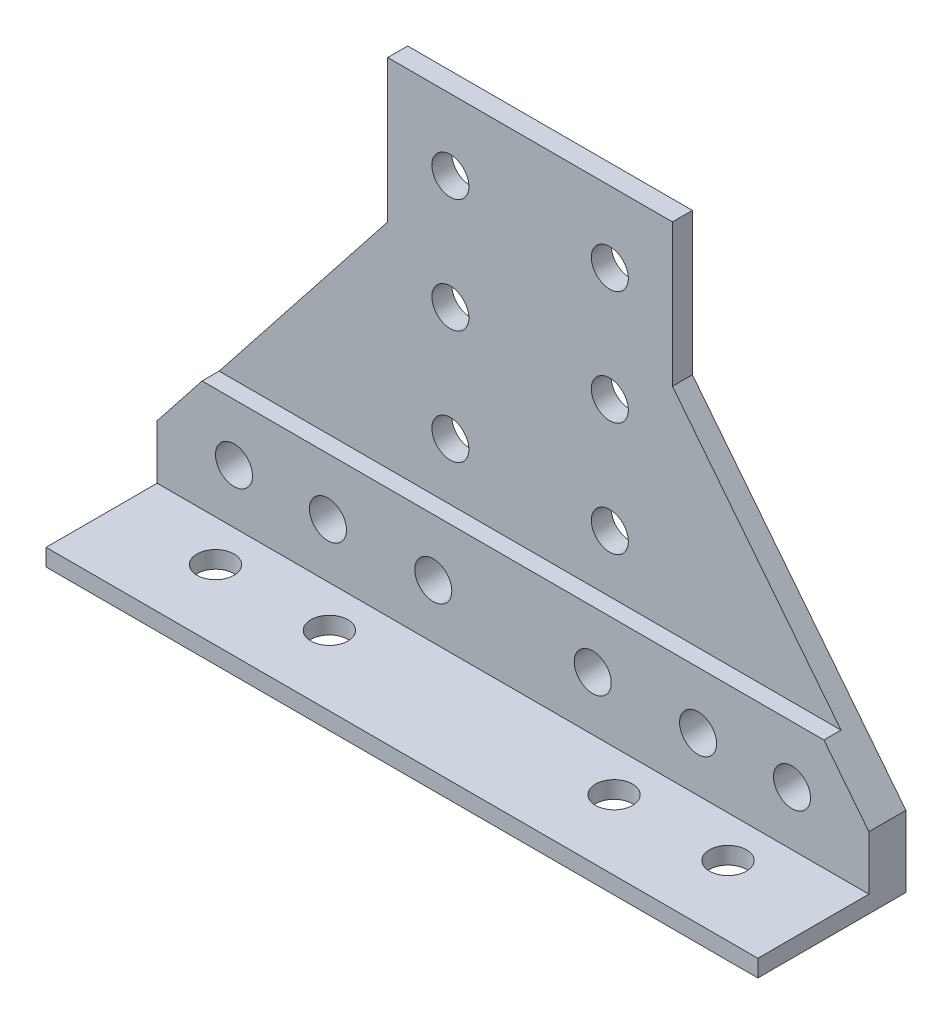
ISO-10303-21;
HEADER;
FILE_DESCRIPTION(('STEP AP214'),'2;1');
FILE_NAME('part.step','',(''),(''),'','','');
FILE_SCHEMA(('AUTOMOTIVE_DESIGN { 1 0 10303 214 1 1 1 1 }'));
ENDSEC;
DATA;
#1=APPLICATION_CONTEXT('core data for automotive mechanical design processes');
#2=APPLICATION_PROTOCOL_DEFINITION('international standard','automotive_design',2000,#1);
#3=PRODUCT_CONTEXT('',#1,'mechanical');
#4=PRODUCT('Part','Part','',(#3));
#5=PRODUCT_RELATED_PRODUCT_CATEGORY('part','',(#4));
#6=PRODUCT_DEFINITION_FORMATION('','',#4);
#7=PRODUCT_DEFINITION_CONTEXT('part definition',#1,'design');
#8=PRODUCT_DEFINITION('design','',#6,#7);
#9=PRODUCT_DEFINITION_SHAPE('','',#8);
#10=(LENGTH_UNIT() NAMED_UNIT(*) SI_UNIT(.MILLI.,.METRE.));
#11=(NAMED_UNIT(*) PLANE_ANGLE_UNIT() SI_UNIT($,.RADIAN.));
#12=(NAMED_UNIT(*) SI_UNIT($,.STERADIAN.) SOLID_ANGLE_UNIT());
#13=UNCERTAINTY_MEASURE_WITH_UNIT(LENGTH_MEASURE(1.E-05),#10,'distance_accuracy_value','');
#14=(GEOMETRIC_REPRESENTATION_CONTEXT(3) GLOBAL_UNCERTAINTY_ASSIGNED_CONTEXT((#13)) GLOBAL_UNIT_ASSIGNED_CONTEXT((#10,
#11,#12)) REPRESENTATION_CONTEXT('',''));
#15=CARTESIAN_POINT('',(0.,0.,0.));
#16=DIRECTION('',(0.,0.,1.));
#17=DIRECTION('',(1.,0.,0.));
#18=AXIS2_PLACEMENT_3D('',#15,#16,#17);
#19=CARTESIAN_POINT('',(0.,0.,14.));
#20=DIRECTION('',(0.,1.,0.));
#21=DIRECTION('',(0.,0.,1.));
#22=AXIS2_PLACEMENT_3D('',#19,#20,#21);
#23=PLANE('',#22);
#24=CARTESIAN_POINT('',(180.,0.,55.));
#25=DIRECTION('',(0.,1.,0.));
#26=DIRECTION('',(0.,0.,-1.));
#27=AXIS2_PLACEMENT_3D('',#24,#25,#26);
#28=CIRCLE('',#27,13.);
#29=CARTESIAN_POINT('',(180.,0.,42.));
#30=VERTEX_POINT('',#29);
#31=EDGE_CURVE('E190',#30,#30,#28,.T.);
#32=ORIENTED_EDGE('',*,*,#31,.T.);
#33=EDGE_LOOP('',(#32));
#34=FACE_BOUND('',#33,.T.);
#35=CARTESIAN_POINT('',(-99.9999999999999,0.,55.));
#36=DIRECTION('',(0.,-1.,0.));
#37=DIRECTION('',(0.,0.,-1.));
#38=AXIS2_PLACEMENT_3D('',#35,#36,#37);
#39=CIRCLE('',#38,13.);
#40=CARTESIAN_POINT('',(-99.9999999999999,0.,42.));
#41=VERTEX_POINT('',#40);
#42=EDGE_CURVE('E187',#41,#41,#39,.T.);
#43=ORIENTED_EDGE('',*,*,#42,.F.);
#44=EDGE_LOOP('',(#43));
#45=FACE_BOUND('',#44,.T.);
#46=CARTESIAN_POINT('',(-180.,0.,55.));
#47=DIRECTION('',(0.,-1.,0.));
#48=DIRECTION('',(0.,0.,-1.));
#49=AXIS2_PLACEMENT_3D('',#46,#47,#48);
#50=CIRCLE('',#49,13.);
#51=CARTESIAN_POINT('',(-180.,0.,42.));
#52=VERTEX_POINT('',#51);
#53=EDGE_CURVE('E159',#52,#52,#50,.T.);
#54=ORIENTED_EDGE('',*,*,#53,.F.);
#55=EDGE_LOOP('',(#54));
#56=FACE_BOUND('',#55,.T.);
#57=DIRECTION('',(1.,0.,0.));
#58=VECTOR('',#57,1.);
#59=CARTESIAN_POINT('',(0.,0.,0.));
#60=LINE('',#59,#58);
#61=CARTESIAN_POINT('',(-250.,0.,0.));
#62=VERTEX_POINT('',#61);
#63=CARTESIAN_POINT('',(250.,0.,0.));
#64=VERTEX_POINT('',#63);
#65=EDGE_CURVE('E327',#62,#64,#60,.T.);
#66=ORIENTED_EDGE('',*,*,#65,.T.);
#67=DIRECTION('',(0.,0.,-1.));
#68=VECTOR('',#67,1.);
#69=CARTESIAN_POINT('',(250.,0.,14.));
#70=LINE('',#69,#68);
#71=CARTESIAN_POINT('',(250.,0.,104.));
#72=VERTEX_POINT('',#71);
#73=EDGE_CURVE('E141',#72,#64,#70,.T.);
#74=ORIENTED_EDGE('',*,*,#73,.F.);
#75=DIRECTION('',(1.,0.,0.));
#76=VECTOR('',#75,1.);
#77=CARTESIAN_POINT('',(-250.,0.,104.));
#78=LINE('',#77,#76);
#79=CARTESIAN_POINT('',(-250.,0.,104.));
#80=VERTEX_POINT('',#79);
#81=EDGE_CURVE('E144',#80,#72,#78,.T.);
#82=ORIENTED_EDGE('',*,*,#81,.F.);
#83=DIRECTION('',(0.,0.,-1.));
#84=VECTOR('',#83,1.);
#85=CARTESIAN_POINT('',(-250.,0.,14.));
#86=LINE('',#85,#84);
#87=EDGE_CURVE('E130',#80,#62,#86,.T.);
#88=ORIENTED_EDGE('',*,*,#87,.T.);
#89=EDGE_LOOP('',(#66,#74,#82,#88));
#90=FACE_BOUND('',#89,.T.);
#91=CARTESIAN_POINT('',(99.9999999999999,0.,55.));
#92=DIRECTION('',(0.,1.,0.));
#93=DIRECTION('',(0.,0.,-1.));
#94=AXIS2_PLACEMENT_3D('',#91,#92,#93);
#95=CIRCLE('',#94,13.);
#96=CARTESIAN_POINT('',(99.9999999999999,0.,42.));
#97=VERTEX_POINT('',#96);
#98=EDGE_CURVE('E199',#97,#97,#95,.T.);
#99=ORIENTED_EDGE('',*,*,#98,.T.);
#100=EDGE_LOOP('',(#99));
#101=FACE_BOUND('',#100,.T.);
#102=ADVANCED_FACE('F36',(#34,#45,#56,#90,#101),#23,.F.);
#103=CARTESIAN_POINT('',(-250.,12.,104.));
#104=DIRECTION('',(0.,-1.,0.));
#105=DIRECTION('',(0.,0.,-1.));
#106=AXIS2_PLACEMENT_3D('',#103,#104,#105);
#107=PLANE('',#106);
#108=CARTESIAN_POINT('',(180.,12.,55.));
#109=DIRECTION('',(0.,-1.,0.));
#110=DIRECTION('',(0.,0.,-1.));
#111=AXIS2_PLACEMENT_3D('',#108,#109,#110);
#112=CIRCLE('',#111,13.);
#113=CARTESIAN_POINT('',(180.,12.,42.));
#114=VERTEX_POINT('',#113);
#115=EDGE_CURVE('E188',#114,#114,#112,.F.);
#116=ORIENTED_EDGE('',*,*,#115,.F.);
#117=EDGE_LOOP('',(#116));
#118=FACE_BOUND('',#117,.T.);
#119=CARTESIAN_POINT('',(-99.9999999999999,12.,55.));
#120=DIRECTION('',(0.,-1.,0.));
#121=DIRECTION('',(0.,0.,-1.));
#122=AXIS2_PLACEMENT_3D('',#119,#120,#121);
#123=CIRCLE('',#122,13.);
#124=CARTESIAN_POINT('',(-99.9999999999999,12.,42.));
#125=VERTEX_POINT('',#124);
#126=EDGE_CURVE('E185',#125,#125,#123,.T.);
#127=ORIENTED_EDGE('',*,*,#126,.T.);
#128=EDGE_LOOP('',(#127));
#129=FACE_BOUND('',#128,.T.);
#130=CARTESIAN_POINT('',(-180.,12.,55.));
#131=DIRECTION('',(0.,-1.,0.));
#132=DIRECTION('',(0.,0.,-1.));
#133=AXIS2_PLACEMENT_3D('',#130,#131,#132);
#134=CIRCLE('',#133,13.);
#135=CARTESIAN_POINT('',(-180.,12.,42.));
#136=VERTEX_POINT('',#135);
#137=EDGE_CURVE('E156',#136,#136,#134,.T.);
#138=ORIENTED_EDGE('',*,*,#137,.T.);
#139=EDGE_LOOP('',(#138));
#140=FACE_BOUND('',#139,.T.);
#141=DIRECTION('',(-1.,0.,0.));
#142=VECTOR('',#141,1.);
#143=CARTESIAN_POINT('',(-250.,12.,26.));
#144=LINE('',#143,#142);
#145=CARTESIAN_POINT('',(250.,12.,26.));
#146=VERTEX_POINT('',#145);
#147=CARTESIAN_POINT('',(-250.,12.,26.));
#148=VERTEX_POINT('',#147);
#149=EDGE_CURVE('E53',#146,#148,#144,.T.);
#150=ORIENTED_EDGE('',*,*,#149,.T.);
#151=DIRECTION('',(0.,0.,-1.));
#152=VECTOR('',#151,1.);
#153=CARTESIAN_POINT('',(-250.,12.,104.));
#154=LINE('',#153,#152);
#155=CARTESIAN_POINT('',(-250.,12.,104.));
#156=VERTEX_POINT('',#155);
#157=EDGE_CURVE('E164',#156,#148,#154,.T.);
#158=ORIENTED_EDGE('',*,*,#157,.F.);
#159=DIRECTION('',(-1.,0.,0.));
#160=VECTOR('',#159,1.);
#161=CARTESIAN_POINT('',(-250.,12.,104.));
#162=LINE('',#161,#160);
#163=CARTESIAN_POINT('',(250.,12.,104.));
#164=VERTEX_POINT('',#163);
#165=EDGE_CURVE('E153',#164,#156,#162,.T.);
#166=ORIENTED_EDGE('',*,*,#165,.F.);
#167=DIRECTION('',(0.,0.,-1.));
#168=VECTOR('',#167,1.);
#169=CARTESIAN_POINT('',(250.,12.,104.));
#170=LINE('',#169,#168);
#171=EDGE_CURVE('E175',#164,#146,#170,.T.);
#172=ORIENTED_EDGE('',*,*,#171,.T.);
#173=EDGE_LOOP('',(#150,#158,#166,#172));
#174=FACE_BOUND('',#173,.T.);
#175=CARTESIAN_POINT('',(99.9999999999999,12.,55.));
#176=DIRECTION('',(0.,-1.,0.));
#177=DIRECTION('',(0.,0.,-1.));
#178=AXIS2_PLACEMENT_3D('',#175,#176,#177);
#179=CIRCLE('',#178,13.);
#180=CARTESIAN_POINT('',(99.9999999999999,12.,42.));
#181=VERTEX_POINT('',#180);
#182=EDGE_CURVE('E40',#181,#181,#179,.F.);
#183=ORIENTED_EDGE('',*,*,#182,.F.);
#184=EDGE_LOOP('',(#183));
#185=FACE_BOUND('',#184,.T.);
#186=ADVANCED_FACE('F211',(#118,#129,#140,#174,#185),#107,.F.);
#187=CARTESIAN_POINT('',(-100.,340.,0.));
#188=DIRECTION('',(0.,0.,1.));
#189=DIRECTION('',(1.,0.,0.));
#190=AXIS2_PLACEMENT_3D('',#187,#188,#189);
#191=PLANE('',#190);
#192=CARTESIAN_POINT('',(130.,50.,0.));
#193=DIRECTION('',(0.,0.,-1.));
#194=DIRECTION('',(-1.,0.,0.));
#195=AXIS2_PLACEMENT_3D('',#192,#193,#194);
#196=CIRCLE('',#195,13.);
#197=CARTESIAN_POINT('',(117.,50.,0.));
#198=VERTEX_POINT('',#197);
#199=EDGE_CURVE('E427',#198,#198,#196,.T.);
#200=ORIENTED_EDGE('',*,*,#199,.F.);
#201=EDGE_LOOP('',(#200));
#202=FACE_BOUND('',#201,.T.);
#203=CARTESIAN_POINT('',(56.,130.,0.));
#204=DIRECTION('',(0.,0.,-1.));
#205=DIRECTION('',(-1.,0.,0.));
#206=AXIS2_PLACEMENT_3D('',#203,#204,#205);
#207=CIRCLE('',#206,13.);
#208=CARTESIAN_POINT('',(43.,130.,0.));
#209=VERTEX_POINT('',#208);
#210=EDGE_CURVE('E390',#209,#209,#207,.T.);
#211=ORIENTED_EDGE('',*,*,#210,.F.);
#212=EDGE_LOOP('',(#211));
#213=FACE_BOUND('',#212,.T.);
#214=CARTESIAN_POINT('',(56.,290.,0.));
#215=DIRECTION('',(0.,0.,-1.));
#216=DIRECTION('',(-1.,0.,0.));
#217=AXIS2_PLACEMENT_3D('',#214,#215,#216);
#218=CIRCLE('',#217,13.);
#219=CARTESIAN_POINT('',(43.,290.,0.));
#220=VERTEX_POINT('',#219);
#221=EDGE_CURVE('E450',#220,#220,#218,.T.);
#222=ORIENTED_EDGE('',*,*,#221,.F.);
#223=EDGE_LOOP('',(#222));
#224=FACE_BOUND('',#223,.T.);
#225=CARTESIAN_POINT('',(-56.,210.,0.));
#226=DIRECTION('',(0.,0.,1.));
#227=DIRECTION('',(1.,0.,0.));
#228=AXIS2_PLACEMENT_3D('',#225,#226,#227);
#229=CIRCLE('',#228,13.);
#230=CARTESIAN_POINT('',(-43.,210.,0.));
#231=VERTEX_POINT('',#230);
#232=EDGE_CURVE('E454',#231,#231,#229,.T.);
#233=ORIENTED_EDGE('',*,*,#232,.T.);
#234=EDGE_LOOP('',(#233));
#235=FACE_BOUND('',#234,.T.);
#236=CARTESIAN_POINT('',(-56.,290.,0.));
#237=DIRECTION('',(0.,0.,1.));
#238=DIRECTION('',(1.,0.,0.));
#239=AXIS2_PLACEMENT_3D('',#236,#237,#238);
#240=CIRCLE('',#239,13.);
#241=CARTESIAN_POINT('',(-43.,290.,0.));
#242=VERTEX_POINT('',#241);
#243=EDGE_CURVE('E320',#242,#242,#240,.T.);
#244=ORIENTED_EDGE('',*,*,#243,.T.);
#245=EDGE_LOOP('',(#244));
#246=FACE_BOUND('',#245,.T.);
#247=DIRECTION('',(0.,-1.,0.));
#248=VECTOR('',#247,1.);
#249=CARTESIAN_POINT('',(-100.,340.,0.));
#250=LINE('',#249,#248);
#251=CARTESIAN_POINT('',(-100.,340.,0.));
#252=VERTEX_POINT('',#251);
#253=CARTESIAN_POINT('',(-100.,240.,0.));
#254=VERTEX_POINT('',#253);
#255=EDGE_CURVE('E310',#252,#254,#250,.T.);
#256=ORIENTED_EDGE('',*,*,#255,.F.);
#257=DIRECTION('',(-1.,0.,0.));
#258=VECTOR('',#257,1.);
#259=CARTESIAN_POINT('',(0.,340.,0.));
#260=LINE('',#259,#258);
#261=CARTESIAN_POINT('',(100.,340.,0.));
#262=VERTEX_POINT('',#261);
#263=EDGE_CURVE('E338',#262,#252,#260,.T.);
#264=ORIENTED_EDGE('',*,*,#263,.F.);
#265=DIRECTION('',(0.,1.,0.));
#266=VECTOR('',#265,1.);
#267=CARTESIAN_POINT('',(100.,340.,0.));
#268=LINE('',#267,#266);
#269=CARTESIAN_POINT('',(100.,240.,0.));
#270=VERTEX_POINT('',#269);
#271=EDGE_CURVE('E336',#270,#262,#268,.T.);
#272=ORIENTED_EDGE('',*,*,#271,.F.);
#273=DIRECTION('',(-0.619644288579021,0.784882765533426,0.));
#274=VECTOR('',#273,1.);
#275=CARTESIAN_POINT('',(100.,240.,0.));
#276=LINE('',#275,#274);
#277=CARTESIAN_POINT('',(250.,50.,0.));
#278=VERTEX_POINT('',#277);
#279=EDGE_CURVE('E334',#278,#270,#276,.T.);
#280=ORIENTED_EDGE('',*,*,#279,.F.);
#281=DIRECTION('',(0.,1.,0.));
#282=VECTOR('',#281,1.);
#283=CARTESIAN_POINT('',(250.,0.,0.));
#284=LINE('',#283,#282);
#285=EDGE_CURVE('E332',#64,#278,#284,.T.);
#286=ORIENTED_EDGE('',*,*,#285,.F.);
#287=ORIENTED_EDGE('',*,*,#65,.F.);
#288=DIRECTION('',(0.,-1.,0.));
#289=VECTOR('',#288,1.);
#290=CARTESIAN_POINT('',(-250.,0.,0.));
#291=LINE('',#290,#289);
#292=CARTESIAN_POINT('',(-250.,50.,0.));
#293=VERTEX_POINT('',#292);
#294=EDGE_CURVE('E138',#293,#62,#291,.T.);
#295=ORIENTED_EDGE('',*,*,#294,.F.);
#296=DIRECTION('',(-0.619644288579021,-0.784882765533426,0.));
#297=VECTOR('',#296,1.);
#298=CARTESIAN_POINT('',(-100.,240.,0.));
#299=LINE('',#298,#297);
#300=EDGE_CURVE('E319',#254,#293,#299,.T.);
#301=ORIENTED_EDGE('',*,*,#300,.F.);
#302=EDGE_LOOP('',(#256,#264,#272,#280,#286,#287,#295,#301));
#303=FACE_BOUND('',#302,.T.);
#304=CARTESIAN_POINT('',(-56.,130.,0.));
#305=DIRECTION('',(0.,0.,1.));
#306=DIRECTION('',(1.,0.,0.));
#307=AXIS2_PLACEMENT_3D('',#304,#305,#306);
#308=CIRCLE('',#307,13.);
#309=CARTESIAN_POINT('',(-43.,130.,0.));
#310=VERTEX_POINT('',#309);
#311=EDGE_CURVE('E45',#310,#310,#308,.T.);
#312=ORIENTED_EDGE('',*,*,#311,.T.);
#313=EDGE_LOOP('',(#312));
#314=FACE_BOUND('',#313,.T.);
#315=CARTESIAN_POINT('',(56.,210.,0.));
#316=DIRECTION('',(0.,0.,-1.));
#317=DIRECTION('',(-1.,0.,0.));
#318=AXIS2_PLACEMENT_3D('',#315,#316,#317);
#319=CIRCLE('',#318,13.);
#320=CARTESIAN_POINT('',(43.,210.,0.));
#321=VERTEX_POINT('',#320);
#322=EDGE_CURVE('E469',#321,#321,#319,.T.);
#323=ORIENTED_EDGE('',*,*,#322,.F.);
#324=EDGE_LOOP('',(#323));
#325=FACE_BOUND('',#324,.T.);
#326=CARTESIAN_POINT('',(-56.,50.,0.));
#327=DIRECTION('',(0.,0.,1.));
#328=DIRECTION('',(1.,0.,0.));
#329=AXIS2_PLACEMENT_3D('',#326,#327,#328);
#330=CIRCLE('',#329,13.);
#331=CARTESIAN_POINT('',(-43.,50.,0.));
#332=VERTEX_POINT('',#331);
#333=EDGE_CURVE('E393',#332,#332,#330,.T.);
#334=ORIENTED_EDGE('',*,*,#333,.T.);
#335=EDGE_LOOP('',(#334));
#336=FACE_BOUND('',#335,.T.);
#337=CARTESIAN_POINT('',(-130.,50.,0.));
#338=DIRECTION('',(0.,0.,1.));
#339=DIRECTION('',(1.,0.,0.));
#340=AXIS2_PLACEMENT_3D('',#337,#338,#339);
#341=CIRCLE('',#340,13.);
#342=CARTESIAN_POINT('',(-117.,50.,0.));
#343=VERTEX_POINT('',#342);
#344=EDGE_CURVE('E409',#343,#343,#341,.T.);
#345=ORIENTED_EDGE('',*,*,#344,.T.);
#346=EDGE_LOOP('',(#345));
#347=FACE_BOUND('',#346,.T.);
#348=CARTESIAN_POINT('',(-196.,50.,0.));
#349=DIRECTION('',(0.,0.,1.));
#350=DIRECTION('',(1.,0.,0.));
#351=AXIS2_PLACEMENT_3D('',#348,#349,#350);
#352=CIRCLE('',#351,13.);
#353=CARTESIAN_POINT('',(-183.,50.,0.));
#354=VERTEX_POINT('',#353);
#355=EDGE_CURVE('E415',#354,#354,#352,.T.);
#356=ORIENTED_EDGE('',*,*,#355,.T.);
#357=EDGE_LOOP('',(#356));
#358=FACE_BOUND('',#357,.T.);
#359=CARTESIAN_POINT('',(56.,50.,0.));
#360=DIRECTION('',(0.,0.,-1.));
#361=DIRECTION('',(-1.,0.,0.));
#362=AXIS2_PLACEMENT_3D('',#359,#360,#361);
#363=CIRCLE('',#362,13.);
#364=CARTESIAN_POINT('',(43.,50.,0.));
#365=VERTEX_POINT('',#364);
#366=EDGE_CURVE('E421',#365,#365,#363,.T.);
#367=ORIENTED_EDGE('',*,*,#366,.F.);
#368=EDGE_LOOP('',(#367));
#369=FACE_BOUND('',#368,.T.);
#370=CARTESIAN_POINT('',(196.,50.,0.));
#371=DIRECTION('',(0.,0.,-1.));
#372=DIRECTION('',(-1.,0.,0.));
#373=AXIS2_PLACEMENT_3D('',#370,#371,#372);
#374=CIRCLE('',#373,13.);
#375=CARTESIAN_POINT('',(183.,50.,0.));
#376=VERTEX_POINT('',#375);
#377=EDGE_CURVE('E167',#376,#376,#374,.T.);
#378=ORIENTED_EDGE('',*,*,#377,.F.);
#379=EDGE_LOOP('',(#378));
#380=FACE_BOUND('',#379,.T.);
#381=ADVANCED_FACE('F213',(#202,#213,#224,#235,#246,#303,#314,#325,#336,#347,#358,#369,#380),
#191,.F.);
#382=CARTESIAN_POINT('',(0.,0.,26.));
#383=DIRECTION('',(0.,0.,1.));
#384=DIRECTION('',(1.,0.,0.));
#385=AXIS2_PLACEMENT_3D('',#382,#383,#384);
#386=PLANE('',#385);
#387=ORIENTED_EDGE('',*,*,#149,.F.);
#388=DIRECTION('',(0.,1.,0.));
#389=VECTOR('',#388,1.);
#390=CARTESIAN_POINT('',(250.,0.,26.));
#391=LINE('',#390,#389);
#392=CARTESIAN_POINT('',(250.,49.9999999999999,26.));
#393=VERTEX_POINT('',#392);
#394=EDGE_CURVE('E171',#146,#393,#391,.T.);
#395=ORIENTED_EDGE('',*,*,#394,.T.);
#396=DIRECTION('',(-0.619644288579021,0.784882765533426,0.));
#397=VECTOR('',#396,1.);
#398=CARTESIAN_POINT('',(178.327645051195,140.784982935154,26.));
#399=LINE('',#398,#397);
#400=CARTESIAN_POINT('',(218.421052631579,90.,26.));
#401=VERTEX_POINT('',#400);
#402=EDGE_CURVE('E379',#393,#401,#399,.T.);
#403=ORIENTED_EDGE('',*,*,#402,.T.);
#404=DIRECTION('',(1.,0.,0.));
#405=VECTOR('',#404,1.);
#406=CARTESIAN_POINT('',(0.,90.,26.));
#407=LINE('',#406,#405);
#408=CARTESIAN_POINT('',(-218.421052631579,90.,26.));
#409=VERTEX_POINT('',#408);
#410=EDGE_CURVE('E392',#409,#401,#407,.T.);
#411=ORIENTED_EDGE('',*,*,#410,.F.);
#412=DIRECTION('',(-0.619644288579021,-0.784882765533426,0.));
#413=VECTOR('',#412,1.);
#414=CARTESIAN_POINT('',(-178.327645051195,140.784982935154,26.));
#415=LINE('',#414,#413);
#416=CARTESIAN_POINT('',(-250.,50.,26.));
#417=VERTEX_POINT('',#416);
#418=EDGE_CURVE('E400',#409,#417,#415,.T.);
#419=ORIENTED_EDGE('',*,*,#418,.T.);
#420=DIRECTION('',(0.,-1.,0.));
#421=VECTOR('',#420,1.);
#422=CARTESIAN_POINT('',(-250.,0.,26.));
#423=LINE('',#422,#421);
#424=EDGE_CURVE('E384',#417,#148,#423,.T.);
#425=ORIENTED_EDGE('',*,*,#424,.T.);
#426=EDGE_LOOP('',(#387,#395,#403,#411,#419,#425));
#427=FACE_BOUND('',#426,.T.);
#428=CARTESIAN_POINT('',(130.,50.,26.));
#429=DIRECTION('',(0.,0.,-1.));
#430=DIRECTION('',(-1.,0.,0.));
#431=AXIS2_PLACEMENT_3D('',#428,#429,#430);
#432=CIRCLE('',#431,13.);
#433=CARTESIAN_POINT('',(117.,50.,26.));
#434=VERTEX_POINT('',#433);
#435=EDGE_CURVE('E430',#434,#434,#432,.T.);
#436=ORIENTED_EDGE('',*,*,#435,.T.);
#437=EDGE_LOOP('',(#436));
#438=FACE_BOUND('',#437,.T.);
#439=CARTESIAN_POINT('',(-56.,50.,26.));
#440=DIRECTION('',(0.,0.,1.));
#441=DIRECTION('',(1.,0.,0.));
#442=AXIS2_PLACEMENT_3D('',#439,#440,#441);
#443=CIRCLE('',#442,13.);
#444=CARTESIAN_POINT('',(-43.,50.,26.));
#445=VERTEX_POINT('',#444);
#446=EDGE_CURVE('E406',#445,#445,#443,.T.);
#447=ORIENTED_EDGE('',*,*,#446,.F.);
#448=EDGE_LOOP('',(#447));
#449=FACE_BOUND('',#448,.T.);
#450=CARTESIAN_POINT('',(-130.,50.,26.));
#451=DIRECTION('',(0.,0.,1.));
#452=DIRECTION('',(1.,0.,0.));
#453=AXIS2_PLACEMENT_3D('',#450,#451,#452);
#454=CIRCLE('',#453,13.);
#455=CARTESIAN_POINT('',(-117.,50.,26.));
#456=VERTEX_POINT('',#455);
#457=EDGE_CURVE('E412',#456,#456,#454,.T.);
#458=ORIENTED_EDGE('',*,*,#457,.F.);
#459=EDGE_LOOP('',(#458));
#460=FACE_BOUND('',#459,.T.);
#461=CARTESIAN_POINT('',(-196.,50.,26.));
#462=DIRECTION('',(0.,0.,1.));
#463=DIRECTION('',(1.,0.,0.));
#464=AXIS2_PLACEMENT_3D('',#461,#462,#463);
#465=CIRCLE('',#464,13.);
#466=CARTESIAN_POINT('',(-183.,50.,26.));
#467=VERTEX_POINT('',#466);
#468=EDGE_CURVE('E418',#467,#467,#465,.T.);
#469=ORIENTED_EDGE('',*,*,#468,.F.);
#470=EDGE_LOOP('',(#469));
#471=FACE_BOUND('',#470,.T.);
#472=CARTESIAN_POINT('',(56.,50.,26.));
#473=DIRECTION('',(0.,0.,-1.));
#474=DIRECTION('',(-1.,0.,0.));
#475=AXIS2_PLACEMENT_3D('',#472,#473,#474);
#476=CIRCLE('',#475,13.);
#477=CARTESIAN_POINT('',(43.,50.,26.));
#478=VERTEX_POINT('',#477);
#479=EDGE_CURVE('E424',#478,#478,#476,.T.);
#480=ORIENTED_EDGE('',*,*,#479,.T.);
#481=EDGE_LOOP('',(#480));
#482=FACE_BOUND('',#481,.T.);
#483=CARTESIAN_POINT('',(196.,50.,26.));
#484=DIRECTION('',(0.,0.,-1.));
#485=DIRECTION('',(-1.,0.,0.));
#486=AXIS2_PLACEMENT_3D('',#483,#484,#485);
#487=CIRCLE('',#486,13.);
#488=CARTESIAN_POINT('',(183.,50.,26.));
#489=VERTEX_POINT('',#488);
#490=EDGE_CURVE('E180',#489,#489,#487,.T.);
#491=ORIENTED_EDGE('',*,*,#490,.T.);
#492=EDGE_LOOP('',(#491));
#493=FACE_BOUND('',#492,.T.);
#494=ADVANCED_FACE('F220',(#427,#438,#449,#460,#471,#482,#493),#386,.T.);
#495=CARTESIAN_POINT('',(-100.,340.,14.));
#496=DIRECTION('',(0.,0.,1.));
#497=DIRECTION('',(1.,0.,0.));
#498=AXIS2_PLACEMENT_3D('',#495,#496,#497);
#499=PLANE('',#498);
#500=CARTESIAN_POINT('',(56.,130.,14.));
#501=DIRECTION('',(0.,0.,-1.));
#502=DIRECTION('',(-1.,0.,0.));
#503=AXIS2_PLACEMENT_3D('',#500,#501,#502);
#504=CIRCLE('',#503,13.);
#505=CARTESIAN_POINT('',(43.,130.,14.));
#506=VERTEX_POINT('',#505);
#507=EDGE_CURVE('E398',#506,#506,#504,.T.);
#508=ORIENTED_EDGE('',*,*,#507,.T.);
#509=EDGE_LOOP('',(#508));
#510=FACE_BOUND('',#509,.T.);
#511=CARTESIAN_POINT('',(56.,290.,14.));
#512=DIRECTION('',(0.,0.,-1.));
#513=DIRECTION('',(-1.,0.,0.));
#514=AXIS2_PLACEMENT_3D('',#511,#512,#513);
#515=CIRCLE('',#514,13.);
#516=CARTESIAN_POINT('',(43.,290.,14.));
#517=VERTEX_POINT('',#516);
#518=EDGE_CURVE('E466',#517,#517,#515,.T.);
#519=ORIENTED_EDGE('',*,*,#518,.T.);
#520=EDGE_LOOP('',(#519));
#521=FACE_BOUND('',#520,.T.);
#522=CARTESIAN_POINT('',(-56.,210.,14.));
#523=DIRECTION('',(0.,0.,1.));
#524=DIRECTION('',(1.,0.,0.));
#525=AXIS2_PLACEMENT_3D('',#522,#523,#524);
#526=CIRCLE('',#525,13.);
#527=CARTESIAN_POINT('',(-43.,210.,14.));
#528=VERTEX_POINT('',#527);
#529=EDGE_CURVE('E460',#528,#528,#526,.T.);
#530=ORIENTED_EDGE('',*,*,#529,.F.);
#531=EDGE_LOOP('',(#530));
#532=FACE_BOUND('',#531,.T.);
#533=CARTESIAN_POINT('',(-56.,290.,14.));
#534=DIRECTION('',(0.,0.,1.));
#535=DIRECTION('',(1.,0.,0.));
#536=AXIS2_PLACEMENT_3D('',#533,#534,#535);
#537=CIRCLE('',#536,13.);
#538=CARTESIAN_POINT('',(-43.,290.,14.));
#539=VERTEX_POINT('',#538);
#540=EDGE_CURVE('E457',#539,#539,#537,.T.);
#541=ORIENTED_EDGE('',*,*,#540,.F.);
#542=EDGE_LOOP('',(#541));
#543=FACE_BOUND('',#542,.T.);
#544=CARTESIAN_POINT('',(-56.,130.,14.));
#545=DIRECTION('',(0.,0.,1.));
#546=DIRECTION('',(1.,0.,0.));
#547=AXIS2_PLACEMENT_3D('',#544,#545,#546);
#548=CIRCLE('',#547,13.);
#549=CARTESIAN_POINT('',(-43.,130.,14.));
#550=VERTEX_POINT('',#549);
#551=EDGE_CURVE('E11',#550,#550,#548,.T.);
#552=ORIENTED_EDGE('',*,*,#551,.F.);
#553=EDGE_LOOP('',(#552));
#554=FACE_BOUND('',#553,.T.);
#555=CARTESIAN_POINT('',(56.,210.,14.));
#556=DIRECTION('',(0.,0.,-1.));
#557=DIRECTION('',(-1.,0.,0.));
#558=AXIS2_PLACEMENT_3D('',#555,#556,#557);
#559=CIRCLE('',#558,13.);
#560=CARTESIAN_POINT('',(43.,210.,14.));
#561=VERTEX_POINT('',#560);
#562=EDGE_CURVE('E471',#561,#561,#559,.T.);
#563=ORIENTED_EDGE('',*,*,#562,.T.);
#564=EDGE_LOOP('',(#563));
#565=FACE_BOUND('',#564,.T.);
#566=DIRECTION('',(-0.619644288579021,-0.784882765533426,0.));
#567=VECTOR('',#566,1.);
#568=CARTESIAN_POINT('',(-100.,240.,14.));
#569=LINE('',#568,#567);
#570=CARTESIAN_POINT('',(-100.,240.,14.));
#571=VERTEX_POINT('',#570);
#572=CARTESIAN_POINT('',(-218.421052631579,90.,14.));
#573=VERTEX_POINT('',#572);
#574=EDGE_CURVE('E323',#571,#573,#569,.T.);
#575=ORIENTED_EDGE('',*,*,#574,.T.);
#576=DIRECTION('',(1.,0.,0.));
#577=VECTOR('',#576,1.);
#578=CARTESIAN_POINT('',(0.,90.,14.));
#579=LINE('',#578,#577);
#580=CARTESIAN_POINT('',(218.421052631579,89.9999999999999,14.));
#581=VERTEX_POINT('',#580);
#582=EDGE_CURVE('E373',#573,#581,#579,.T.);
#583=ORIENTED_EDGE('',*,*,#582,.T.);
#584=DIRECTION('',(-0.619644288579021,0.784882765533426,0.));
#585=VECTOR('',#584,1.);
#586=CARTESIAN_POINT('',(100.,240.,14.));
#587=LINE('',#586,#585);
#588=CARTESIAN_POINT('',(100.,240.,14.));
#589=VERTEX_POINT('',#588);
#590=EDGE_CURVE('E358',#581,#589,#587,.T.);
#591=ORIENTED_EDGE('',*,*,#590,.T.);
#592=DIRECTION('',(0.,1.,0.));
#593=VECTOR('',#592,1.);
#594=CARTESIAN_POINT('',(100.,340.,14.));
#595=LINE('',#594,#593);
#596=CARTESIAN_POINT('',(100.,340.,14.));
#597=VERTEX_POINT('',#596);
#598=EDGE_CURVE('E345',#589,#597,#595,.T.);
#599=ORIENTED_EDGE('',*,*,#598,.T.);
#600=DIRECTION('',(-1.,0.,0.));
#601=VECTOR('',#600,1.);
#602=CARTESIAN_POINT('',(0.,340.,14.));
#603=LINE('',#602,#601);
#604=CARTESIAN_POINT('',(-100.,340.,14.));
#605=VERTEX_POINT('',#604);
#606=EDGE_CURVE('E340',#597,#605,#603,.T.);
#607=ORIENTED_EDGE('',*,*,#606,.T.);
#608=DIRECTION('',(0.,-1.,0.));
#609=VECTOR('',#608,1.);
#610=CARTESIAN_POINT('',(-100.,340.,14.));
#611=LINE('',#610,#609);
#612=EDGE_CURVE('E359',#605,#571,#611,.T.);
#613=ORIENTED_EDGE('',*,*,#612,.T.);
#614=EDGE_LOOP('',(#575,#583,#591,#599,#607,#613));
#615=FACE_BOUND('',#614,.T.);
#616=ADVANCED_FACE('F255',(#510,#521,#532,#543,#554,#565,#615),#499,.T.);
#617=CARTESIAN_POINT('',(-100.,340.,14.));
#618=DIRECTION('',(1.,0.,0.));
#619=DIRECTION('',(0.,1.,0.));
#620=AXIS2_PLACEMENT_3D('',#617,#618,#619);
#621=PLANE('',#620);
#622=ORIENTED_EDGE('',*,*,#255,.T.);
#623=DIRECTION('',(0.,0.,-1.));
#624=VECTOR('',#623,1.);
#625=CARTESIAN_POINT('',(-100.,240.,14.));
#626=LINE('',#625,#624);
#627=EDGE_CURVE('E312',#571,#254,#626,.T.);
#628=ORIENTED_EDGE('',*,*,#627,.F.);
#629=ORIENTED_EDGE('',*,*,#612,.F.);
#630=DIRECTION('',(0.,0.,-1.));
#631=VECTOR('',#630,1.);
#632=CARTESIAN_POINT('',(-100.,340.,14.));
#633=LINE('',#632,#631);
#634=EDGE_CURVE('E315',#605,#252,#633,.T.);
#635=ORIENTED_EDGE('',*,*,#634,.T.);
#636=EDGE_LOOP('',(#622,#628,#629,#635));
#637=FACE_BOUND('',#636,.T.);
#638=ADVANCED_FACE('F280',(#637),#621,.F.);
#639=CARTESIAN_POINT('',(-100.,240.,14.));
#640=DIRECTION('',(0.784882765533426,-0.619644288579021,0.));
#641=DIRECTION('',(0.619644288579021,0.784882765533426,0.));
#642=AXIS2_PLACEMENT_3D('',#639,#640,#641);
#643=PLANE('',#642);
#644=ORIENTED_EDGE('',*,*,#300,.T.);
#645=DIRECTION('',(0.,0.,-1.));
#646=VECTOR('',#645,1.);
#647=CARTESIAN_POINT('',(-250.,50.,14.));
#648=LINE('',#647,#646);
#649=EDGE_CURVE('E140',#417,#293,#648,.T.);
#650=ORIENTED_EDGE('',*,*,#649,.F.);
#651=ORIENTED_EDGE('',*,*,#418,.F.);
#652=DIRECTION('',(0.,0.,-1.));
#653=VECTOR('',#652,1.);
#654=CARTESIAN_POINT('',(-218.421052631579,90.,26.));
#655=LINE('',#654,#653);
#656=EDGE_CURVE('E382',#409,#573,#655,.T.);
#657=ORIENTED_EDGE('',*,*,#656,.T.);
#658=ORIENTED_EDGE('',*,*,#574,.F.);
#659=ORIENTED_EDGE('',*,*,#627,.T.);
#660=EDGE_LOOP('',(#644,#650,#651,#657,#658,#659));
#661=FACE_BOUND('',#660,.T.);
#662=ADVANCED_FACE('F300',(#661),#643,.F.);
#663=CARTESIAN_POINT('',(-250.,0.,14.));
#664=DIRECTION('',(1.,0.,0.));
#665=DIRECTION('',(0.,0.,-1.));
#666=AXIS2_PLACEMENT_3D('',#663,#664,#665);
#667=PLANE('',#666);
#668=ORIENTED_EDGE('',*,*,#294,.T.);
#669=ORIENTED_EDGE('',*,*,#87,.F.);
#670=DIRECTION('',(0.,-1.,0.));
#671=VECTOR('',#670,1.);
#672=CARTESIAN_POINT('',(-250.,0.,104.));
#673=LINE('',#672,#671);
#674=EDGE_CURVE('E135',#156,#80,#673,.T.);
#675=ORIENTED_EDGE('',*,*,#674,.F.);
#676=ORIENTED_EDGE('',*,*,#157,.T.);
#677=ORIENTED_EDGE('',*,*,#424,.F.);
#678=ORIENTED_EDGE('',*,*,#649,.T.);
#679=EDGE_LOOP('',(#668,#669,#675,#676,#677,#678));
#680=FACE_BOUND('',#679,.T.);
#681=ADVANCED_FACE('F132',(#680),#667,.F.);
#682=CARTESIAN_POINT('',(250.,0.,14.));
#683=DIRECTION('',(-1.,0.,0.));
#684=DIRECTION('',(0.,0.,1.));
#685=AXIS2_PLACEMENT_3D('',#682,#683,#684);
#686=PLANE('',#685);
#687=ORIENTED_EDGE('',*,*,#285,.T.);
#688=DIRECTION('',(0.,0.,-1.));
#689=VECTOR('',#688,1.);
#690=CARTESIAN_POINT('',(250.,50.,14.));
#691=LINE('',#690,#689);
#692=EDGE_CURVE('E348',#393,#278,#691,.T.);
#693=ORIENTED_EDGE('',*,*,#692,.F.);
#694=ORIENTED_EDGE('',*,*,#394,.F.);
#695=ORIENTED_EDGE('',*,*,#171,.F.);
#696=DIRECTION('',(0.,1.,0.));
#697=VECTOR('',#696,1.);
#698=CARTESIAN_POINT('',(250.,0.,104.));
#699=LINE('',#698,#697);
#700=EDGE_CURVE('E149',#72,#164,#699,.T.);
#701=ORIENTED_EDGE('',*,*,#700,.F.);
#702=ORIENTED_EDGE('',*,*,#73,.T.);
#703=EDGE_LOOP('',(#687,#693,#694,#695,#701,#702));
#704=FACE_BOUND('',#703,.T.);
#705=ADVANCED_FACE('F293',(#704),#686,.F.);
#706=CARTESIAN_POINT('',(100.,240.,14.));
#707=DIRECTION('',(-0.784882765533426,-0.619644288579021,0.));
#708=DIRECTION('',(0.619644288579021,-0.784882765533426,0.));
#709=AXIS2_PLACEMENT_3D('',#706,#707,#708);
#710=PLANE('',#709);
#711=ORIENTED_EDGE('',*,*,#279,.T.);
#712=DIRECTION('',(0.,0.,-1.));
#713=VECTOR('',#712,1.);
#714=CARTESIAN_POINT('',(100.,240.,14.));
#715=LINE('',#714,#713);
#716=EDGE_CURVE('E344',#589,#270,#715,.T.);
#717=ORIENTED_EDGE('',*,*,#716,.F.);
#718=ORIENTED_EDGE('',*,*,#590,.F.);
#719=DIRECTION('',(0.,0.,-1.));
#720=VECTOR('',#719,1.);
#721=CARTESIAN_POINT('',(218.421052631579,90.,26.));
#722=LINE('',#721,#720);
#723=EDGE_CURVE('E61',#401,#581,#722,.T.);
#724=ORIENTED_EDGE('',*,*,#723,.F.);
#725=ORIENTED_EDGE('',*,*,#402,.F.);
#726=ORIENTED_EDGE('',*,*,#692,.T.);
#727=EDGE_LOOP('',(#711,#717,#718,#724,#725,#726));
#728=FACE_BOUND('',#727,.T.);
#729=ADVANCED_FACE('F289',(#728),#710,.F.);
#730=CARTESIAN_POINT('',(100.,340.,14.));
#731=DIRECTION('',(-1.,0.,0.));
#732=DIRECTION('',(0.,0.,1.));
#733=AXIS2_PLACEMENT_3D('',#730,#731,#732);
#734=PLANE('',#733);
#735=ORIENTED_EDGE('',*,*,#271,.T.);
#736=DIRECTION('',(0.,0.,-1.));
#737=VECTOR('',#736,1.);
#738=CARTESIAN_POINT('',(100.,340.,14.));
#739=LINE('',#738,#737);
#740=EDGE_CURVE('E341',#597,#262,#739,.T.);
#741=ORIENTED_EDGE('',*,*,#740,.F.);
#742=ORIENTED_EDGE('',*,*,#598,.F.);
#743=ORIENTED_EDGE('',*,*,#716,.T.);
#744=EDGE_LOOP('',(#735,#741,#742,#743));
#745=FACE_BOUND('',#744,.T.);
#746=ADVANCED_FACE('F285',(#745),#734,.F.);
#747=CARTESIAN_POINT('',(0.,340.,14.));
#748=DIRECTION('',(0.,-1.,0.));
#749=DIRECTION('',(0.,0.,-1.));
#750=AXIS2_PLACEMENT_3D('',#747,#748,#749);
#751=PLANE('',#750);
#752=ORIENTED_EDGE('',*,*,#263,.T.);
#753=ORIENTED_EDGE('',*,*,#634,.F.);
#754=ORIENTED_EDGE('',*,*,#606,.F.);
#755=ORIENTED_EDGE('',*,*,#740,.T.);
#756=EDGE_LOOP('',(#752,#753,#754,#755));
#757=FACE_BOUND('',#756,.T.);
#758=ADVANCED_FACE('F277',(#757),#751,.F.);
#759=CARTESIAN_POINT('',(-56.,290.,0.));
#760=DIRECTION('',(0.,0.,1.));
#761=DIRECTION('',(1.,0.,0.));
#762=AXIS2_PLACEMENT_3D('',#759,#760,#761);
#763=CYLINDRICAL_SURFACE('',#762,13.);
#764=ORIENTED_EDGE('',*,*,#243,.F.);
#765=EDGE_LOOP('',(#764));
#766=FACE_BOUND('',#765,.T.);
#767=ORIENTED_EDGE('',*,*,#540,.T.);
#768=EDGE_LOOP('',(#767));
#769=FACE_BOUND('',#768,.T.);
#770=ADVANCED_FACE('F273',(#766,#769),#763,.F.);
#771=CARTESIAN_POINT('',(-56.,210.,0.));
#772=DIRECTION('',(0.,0.,1.));
#773=DIRECTION('',(1.,0.,0.));
#774=AXIS2_PLACEMENT_3D('',#771,#772,#773);
#775=CYLINDRICAL_SURFACE('',#774,13.);
#776=ORIENTED_EDGE('',*,*,#232,.F.);
#777=EDGE_LOOP('',(#776));
#778=FACE_BOUND('',#777,.T.);
#779=ORIENTED_EDGE('',*,*,#529,.T.);
#780=EDGE_LOOP('',(#779));
#781=FACE_BOUND('',#780,.T.);
#782=ADVANCED_FACE('F270',(#778,#781),#775,.F.);
#783=CARTESIAN_POINT('',(-56.,130.,0.));
#784=DIRECTION('',(0.,0.,1.));
#785=DIRECTION('',(1.,0.,0.));
#786=AXIS2_PLACEMENT_3D('',#783,#784,#785);
#787=CYLINDRICAL_SURFACE('',#786,13.);
#788=ORIENTED_EDGE('',*,*,#311,.F.);
#789=EDGE_LOOP('',(#788));
#790=FACE_BOUND('',#789,.T.);
#791=ORIENTED_EDGE('',*,*,#551,.T.);
#792=EDGE_LOOP('',(#791));
#793=FACE_BOUND('',#792,.T.);
#794=ADVANCED_FACE('F38',(#790,#793),#787,.F.);
#795=CARTESIAN_POINT('',(56.,290.,0.));
#796=DIRECTION('',(0.,0.,1.));
#797=DIRECTION('',(1.,0.,0.));
#798=AXIS2_PLACEMENT_3D('',#795,#796,#797);
#799=CYLINDRICAL_SURFACE('',#798,13.);
#800=ORIENTED_EDGE('',*,*,#221,.T.);
#801=EDGE_LOOP('',(#800));
#802=FACE_BOUND('',#801,.T.);
#803=ORIENTED_EDGE('',*,*,#518,.F.);
#804=EDGE_LOOP('',(#803));
#805=FACE_BOUND('',#804,.T.);
#806=ADVANCED_FACE('F265',(#802,#805),#799,.F.);
#807=CARTESIAN_POINT('',(56.,210.,0.));
#808=DIRECTION('',(0.,0.,1.));
#809=DIRECTION('',(1.,0.,0.));
#810=AXIS2_PLACEMENT_3D('',#807,#808,#809);
#811=CYLINDRICAL_SURFACE('',#810,13.);
#812=ORIENTED_EDGE('',*,*,#322,.T.);
#813=EDGE_LOOP('',(#812));
#814=FACE_BOUND('',#813,.T.);
#815=ORIENTED_EDGE('',*,*,#562,.F.);
#816=EDGE_LOOP('',(#815));
#817=FACE_BOUND('',#816,.T.);
#818=ADVANCED_FACE('F261',(#814,#817),#811,.F.);
#819=CARTESIAN_POINT('',(56.,130.,0.));
#820=DIRECTION('',(0.,0.,1.));
#821=DIRECTION('',(1.,0.,0.));
#822=AXIS2_PLACEMENT_3D('',#819,#820,#821);
#823=CYLINDRICAL_SURFACE('',#822,13.);
#824=ORIENTED_EDGE('',*,*,#210,.T.);
#825=EDGE_LOOP('',(#824));
#826=FACE_BOUND('',#825,.T.);
#827=ORIENTED_EDGE('',*,*,#507,.F.);
#828=EDGE_LOOP('',(#827));
#829=FACE_BOUND('',#828,.T.);
#830=ADVANCED_FACE('F258',(#826,#829),#823,.F.);
#831=CARTESIAN_POINT('',(0.,90.,26.));
#832=DIRECTION('',(0.,1.,0.));
#833=DIRECTION('',(0.,0.,1.));
#834=AXIS2_PLACEMENT_3D('',#831,#832,#833);
#835=PLANE('',#834);
#836=ORIENTED_EDGE('',*,*,#582,.F.);
#837=ORIENTED_EDGE('',*,*,#656,.F.);
#838=ORIENTED_EDGE('',*,*,#410,.T.);
#839=ORIENTED_EDGE('',*,*,#723,.T.);
#840=EDGE_LOOP('',(#836,#837,#838,#839));
#841=FACE_BOUND('',#840,.T.);
#842=ADVANCED_FACE('F251',(#841),#835,.T.);
#843=CARTESIAN_POINT('',(-56.,50.,0.));
#844=DIRECTION('',(0.,0.,1.));
#845=DIRECTION('',(1.,0.,0.));
#846=AXIS2_PLACEMENT_3D('',#843,#844,#845);
#847=CYLINDRICAL_SURFACE('',#846,13.);
#848=ORIENTED_EDGE('',*,*,#333,.F.);
#849=EDGE_LOOP('',(#848));
#850=FACE_BOUND('',#849,.T.);
#851=ORIENTED_EDGE('',*,*,#446,.T.);
#852=EDGE_LOOP('',(#851));
#853=FACE_BOUND('',#852,.T.);
#854=ADVANCED_FACE('F247',(#850,#853),#847,.F.);
#855=CARTESIAN_POINT('',(-130.,50.,0.));
#856=DIRECTION('',(0.,0.,1.));
#857=DIRECTION('',(1.,0.,0.));
#858=AXIS2_PLACEMENT_3D('',#855,#856,#857);
#859=CYLINDRICAL_SURFACE('',#858,13.);
#860=ORIENTED_EDGE('',*,*,#344,.F.);
#861=EDGE_LOOP('',(#860));
#862=FACE_BOUND('',#861,.T.);
#863=ORIENTED_EDGE('',*,*,#457,.T.);
#864=EDGE_LOOP('',(#863));
#865=FACE_BOUND('',#864,.T.);
#866=ADVANCED_FACE('F243',(#862,#865),#859,.F.);
#867=CARTESIAN_POINT('',(-196.,50.,0.));
#868=DIRECTION('',(0.,0.,1.));
#869=DIRECTION('',(1.,0.,0.));
#870=AXIS2_PLACEMENT_3D('',#867,#868,#869);
#871=CYLINDRICAL_SURFACE('',#870,13.);
#872=ORIENTED_EDGE('',*,*,#355,.F.);
#873=EDGE_LOOP('',(#872));
#874=FACE_BOUND('',#873,.T.);
#875=ORIENTED_EDGE('',*,*,#468,.T.);
#876=EDGE_LOOP('',(#875));
#877=FACE_BOUND('',#876,.T.);
#878=ADVANCED_FACE('F239',(#874,#877),#871,.F.);
#879=CARTESIAN_POINT('',(56.,50.,0.));
#880=DIRECTION('',(0.,0.,1.));
#881=DIRECTION('',(1.,0.,0.));
#882=AXIS2_PLACEMENT_3D('',#879,#880,#881);
#883=CYLINDRICAL_SURFACE('',#882,13.);
#884=ORIENTED_EDGE('',*,*,#366,.T.);
#885=EDGE_LOOP('',(#884));
#886=FACE_BOUND('',#885,.T.);
#887=ORIENTED_EDGE('',*,*,#479,.F.);
#888=EDGE_LOOP('',(#887));
#889=FACE_BOUND('',#888,.T.);
#890=ADVANCED_FACE('F235',(#886,#889),#883,.F.);
#891=CARTESIAN_POINT('',(130.,50.,0.));
#892=DIRECTION('',(0.,0.,1.));
#893=DIRECTION('',(1.,0.,0.));
#894=AXIS2_PLACEMENT_3D('',#891,#892,#893);
#895=CYLINDRICAL_SURFACE('',#894,13.);
#896=ORIENTED_EDGE('',*,*,#199,.T.);
#897=EDGE_LOOP('',(#896));
#898=FACE_BOUND('',#897,.T.);
#899=ORIENTED_EDGE('',*,*,#435,.F.);
#900=EDGE_LOOP('',(#899));
#901=FACE_BOUND('',#900,.T.);
#902=ADVANCED_FACE('F231',(#898,#901),#895,.F.);
#903=CARTESIAN_POINT('',(196.,50.,0.));
#904=DIRECTION('',(0.,0.,1.));
#905=DIRECTION('',(1.,0.,0.));
#906=AXIS2_PLACEMENT_3D('',#903,#904,#905);
#907=CYLINDRICAL_SURFACE('',#906,13.);
#908=ORIENTED_EDGE('',*,*,#377,.T.);
#909=EDGE_LOOP('',(#908));
#910=FACE_BOUND('',#909,.T.);
#911=ORIENTED_EDGE('',*,*,#490,.F.);
#912=EDGE_LOOP('',(#911));
#913=FACE_BOUND('',#912,.T.);
#914=ADVANCED_FACE('F228',(#910,#913),#907,.F.);
#915=CARTESIAN_POINT('',(-250.,12.,104.));
#916=DIRECTION('',(0.,0.,-1.));
#917=DIRECTION('',(-1.,0.,0.));
#918=AXIS2_PLACEMENT_3D('',#915,#916,#917);
#919=PLANE('',#918);
#920=ORIENTED_EDGE('',*,*,#674,.T.);
#921=ORIENTED_EDGE('',*,*,#81,.T.);
#922=ORIENTED_EDGE('',*,*,#700,.T.);
#923=ORIENTED_EDGE('',*,*,#165,.T.);
#924=EDGE_LOOP('',(#920,#921,#922,#923));
#925=FACE_BOUND('',#924,.T.);
#926=ADVANCED_FACE('F151',(#925),#919,.F.);
#927=CARTESIAN_POINT('',(-180.,340.,55.));
#928=DIRECTION('',(0.,-1.,0.));
#929=DIRECTION('',(0.,0.,-1.));
#930=AXIS2_PLACEMENT_3D('',#927,#928,#929);
#931=CYLINDRICAL_SURFACE('',#930,13.);
#932=ORIENTED_EDGE('',*,*,#53,.T.);
#933=EDGE_LOOP('',(#932));
#934=FACE_BOUND('',#933,.T.);
#935=ORIENTED_EDGE('',*,*,#137,.F.);
#936=EDGE_LOOP('',(#935));
#937=FACE_BOUND('',#936,.T.);
#938=ADVANCED_FACE('F569',(#934,#937),#931,.F.);
#939=CARTESIAN_POINT('',(-99.9999999999999,340.,55.));
#940=DIRECTION('',(0.,-1.,0.));
#941=DIRECTION('',(0.,0.,-1.));
#942=AXIS2_PLACEMENT_3D('',#939,#940,#941);
#943=CYLINDRICAL_SURFACE('',#942,13.);
#944=ORIENTED_EDGE('',*,*,#42,.T.);
#945=EDGE_LOOP('',(#944));
#946=FACE_BOUND('',#945,.T.);
#947=ORIENTED_EDGE('',*,*,#126,.F.);
#948=EDGE_LOOP('',(#947));
#949=FACE_BOUND('',#948,.T.);
#950=ADVANCED_FACE('F576',(#946,#949),#943,.F.);
#951=CARTESIAN_POINT('',(180.,340.,55.));
#952=DIRECTION('',(0.,-1.,0.));
#953=DIRECTION('',(0.,0.,-1.));
#954=AXIS2_PLACEMENT_3D('',#951,#952,#953);
#955=CYLINDRICAL_SURFACE('',#954,13.);
#956=ORIENTED_EDGE('',*,*,#31,.F.);
#957=EDGE_LOOP('',(#956));
#958=FACE_BOUND('',#957,.T.);
#959=ORIENTED_EDGE('',*,*,#115,.T.);
#960=EDGE_LOOP('',(#959));
#961=FACE_BOUND('',#960,.T.);
#962=ADVANCED_FACE('F207',(#958,#961),#955,.F.);
#963=CARTESIAN_POINT('',(99.9999999999999,340.,55.));
#964=DIRECTION('',(0.,-1.,0.));
#965=DIRECTION('',(0.,0.,-1.));
#966=AXIS2_PLACEMENT_3D('',#963,#964,#965);
#967=CYLINDRICAL_SURFACE('',#966,13.);
#968=ORIENTED_EDGE('',*,*,#98,.F.);
#969=EDGE_LOOP('',(#968));
#970=FACE_BOUND('',#969,.T.);
#971=ORIENTED_EDGE('',*,*,#182,.T.);
#972=EDGE_LOOP('',(#971));
#973=FACE_BOUND('',#972,.T.);
#974=ADVANCED_FACE('F204',(#970,#973),#967,.F.);
#975=CLOSED_SHELL('',(#102,#186,#381,#494,#616,#638,#662,#681,#705,#729,#746,#758,#770,#782,
#794,#806,#818,#830,#842,#854,#866,#878,#890,#902,#914,#926,#938,#950,#962,#974));
#976=MANIFOLD_SOLID_BREP('B2',#975);
#977=ADVANCED_BREP_SHAPE_REPRESENTATION('',(#18,#976),#14);
#978=SHAPE_DEFINITION_REPRESENTATION(#9,#977);
ENDSEC;
END-ISO-10303-21;
